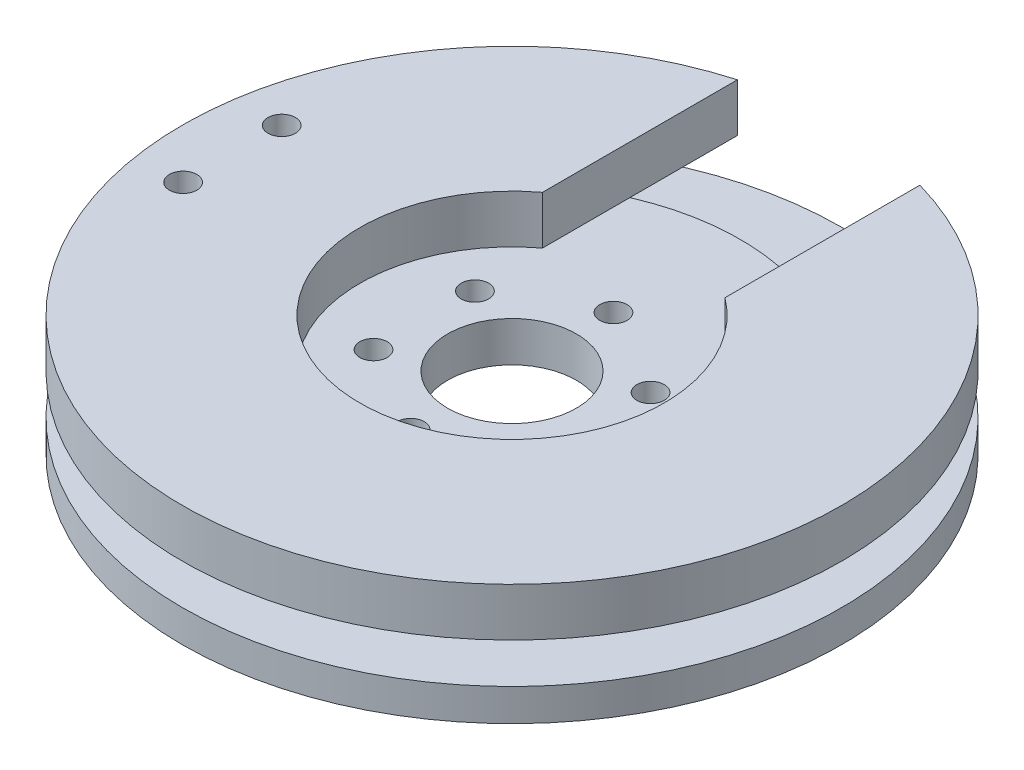
ISO-10303-21;
HEADER;
FILE_DESCRIPTION(('STEP AP214'),'2;1');
FILE_NAME('part.step','',(''),(''),'','','');
FILE_SCHEMA(('AUTOMOTIVE_DESIGN { 1 0 10303 214 1 1 1 1 }'));
ENDSEC;
DATA;
#1=APPLICATION_CONTEXT('core data for automotive mechanical design processes');
#2=APPLICATION_PROTOCOL_DEFINITION('international standard','automotive_design',2000,#1);
#3=PRODUCT_CONTEXT('',#1,'mechanical');
#4=PRODUCT('Part','Part','',(#3));
#5=PRODUCT_RELATED_PRODUCT_CATEGORY('part','',(#4));
#6=PRODUCT_DEFINITION_FORMATION('','',#4);
#7=PRODUCT_DEFINITION_CONTEXT('part definition',#1,'design');
#8=PRODUCT_DEFINITION('design','',#6,#7);
#9=PRODUCT_DEFINITION_SHAPE('','',#8);
#10=(LENGTH_UNIT() NAMED_UNIT(*) SI_UNIT(.MILLI.,.METRE.));
#11=(NAMED_UNIT(*) PLANE_ANGLE_UNIT() SI_UNIT($,.RADIAN.));
#12=(NAMED_UNIT(*) SI_UNIT($,.STERADIAN.) SOLID_ANGLE_UNIT());
#13=UNCERTAINTY_MEASURE_WITH_UNIT(LENGTH_MEASURE(1.E-05),#10,'distance_accuracy_value','');
#14=(GEOMETRIC_REPRESENTATION_CONTEXT(3) GLOBAL_UNCERTAINTY_ASSIGNED_CONTEXT((#13)) GLOBAL_UNIT_ASSIGNED_CONTEXT((#10,
#11,#12)) REPRESENTATION_CONTEXT('',''));
#15=CARTESIAN_POINT('',(0.,0.,0.));
#16=DIRECTION('',(0.,0.,1.));
#17=DIRECTION('',(1.,0.,0.));
#18=AXIS2_PLACEMENT_3D('',#15,#16,#17);
#19=CARTESIAN_POINT('',(0.,-8.7249,0.));
#20=DIRECTION('',(0.,1.,0.));
#21=DIRECTION('',(0.,0.,1.));
#22=AXIS2_PLACEMENT_3D('',#19,#20,#21);
#23=PLANE('',#22);
#24=CARTESIAN_POINT('',(-27.5746170843418,-8.7249,-4.86214897467412));
#25=DIRECTION('',(0.,1.,0.));
#26=DIRECTION('',(0.,0.,1.));
#27=AXIS2_PLACEMENT_3D('',#24,#25,#26);
#28=CIRCLE('',#27,3.57250999999999);
#29=CARTESIAN_POINT('',(-27.5746170843418,-8.7249,-1.28963897467412));
#30=VERTEX_POINT('',#29);
#31=EDGE_CURVE('E44',#30,#30,#28,.T.);
#32=ORIENTED_EDGE('',*,*,#31,.F.);
#33=EDGE_LOOP('',(#32));
#34=FACE_BOUND('',#33,.T.);
#35=CARTESIAN_POINT('',(-27.5746170843418,-8.7249,4.8621489746741));
#36=DIRECTION('',(0.,1.,0.));
#37=DIRECTION('',(0.,0.,1.));
#38=AXIS2_PLACEMENT_3D('',#35,#36,#37);
#39=CIRCLE('',#38,3.57250999999999);
#40=CARTESIAN_POINT('',(-27.5746170843418,-8.7249,8.4346589746741));
#41=VERTEX_POINT('',#40);
#42=EDGE_CURVE('E144',#41,#41,#39,.T.);
#43=ORIENTED_EDGE('',*,*,#42,.F.);
#44=EDGE_LOOP('',(#43));
#45=FACE_BOUND('',#44,.T.);
#46=CARTESIAN_POINT('',(0.,-8.7249,0.));
#47=DIRECTION('',(0.,1.,0.));
#48=DIRECTION('',(0.,0.,1.));
#49=AXIS2_PLACEMENT_3D('',#46,#47,#48);
#50=CIRCLE('',#49,22.5);
#51=CARTESIAN_POINT('',(0.,-8.7249,22.5));
#52=VERTEX_POINT('',#51);
#53=EDGE_CURVE('E107',#52,#52,#50,.F.);
#54=ORIENTED_EDGE('',*,*,#53,.T.);
#55=EDGE_LOOP('',(#54));
#56=FACE_BOUND('',#55,.T.);
#57=CARTESIAN_POINT('',(0.,-8.7249,0.));
#58=DIRECTION('',(0.,1.,0.));
#59=DIRECTION('',(0.,0.,1.));
#60=AXIS2_PLACEMENT_3D('',#57,#58,#59);
#61=CIRCLE('',#60,32.5);
#62=CARTESIAN_POINT('',(0.,-8.7249,32.5));
#63=VERTEX_POINT('',#62);
#64=EDGE_CURVE('E124',#63,#63,#61,.F.);
#65=ORIENTED_EDGE('',*,*,#64,.F.);
#66=EDGE_LOOP('',(#65));
#67=FACE_BOUND('',#66,.T.);
#68=ADVANCED_FACE('F36',(#34,#45,#56,#67),#23,.T.);
#69=CARTESIAN_POINT('',(0.,-4.7625,0.));
#70=DIRECTION('',(0.,1.,0.));
#71=DIRECTION('',(0.,0.,1.));
#72=AXIS2_PLACEMENT_3D('',#69,#70,#71);
#73=PLANE('',#72);
#74=CARTESIAN_POINT('',(0.,-4.7625,10.));
#75=DIRECTION('',(0.,1.,0.));
#76=DIRECTION('',(0.,0.,1.));
#77=AXIS2_PLACEMENT_3D('',#74,#75,#76);
#78=CIRCLE('',#77,1.35254999999999);
#79=CARTESIAN_POINT('',(0.,-4.7625,11.35255));
#80=VERTEX_POINT('',#79);
#81=EDGE_CURVE('E160',#80,#80,#78,.T.);
#82=ORIENTED_EDGE('',*,*,#81,.F.);
#83=EDGE_LOOP('',(#82));
#84=FACE_BOUND('',#83,.T.);
#85=CARTESIAN_POINT('',(-8.66025403784436,-4.7625,-5.00000000000004));
#86=DIRECTION('',(0.,1.,0.));
#87=DIRECTION('',(0.,0.,1.));
#88=AXIS2_PLACEMENT_3D('',#85,#86,#87);
#89=CIRCLE('',#88,1.35254999999999);
#90=CARTESIAN_POINT('',(-8.66025403784436,-4.7625,-3.64745000000005));
#91=VERTEX_POINT('',#90);
#92=EDGE_CURVE('E166',#91,#91,#89,.T.);
#93=ORIENTED_EDGE('',*,*,#92,.F.);
#94=EDGE_LOOP('',(#93));
#95=FACE_BOUND('',#94,.T.);
#96=CARTESIAN_POINT('',(8.66025403784436,-4.7625,-5.00000000000004));
#97=DIRECTION('',(0.,1.,0.));
#98=DIRECTION('',(0.,0.,1.));
#99=AXIS2_PLACEMENT_3D('',#96,#97,#98);
#100=CIRCLE('',#99,1.35254999999999);
#101=CARTESIAN_POINT('',(8.66025403784436,-4.7625,-3.64745000000005));
#102=VERTEX_POINT('',#101);
#103=EDGE_CURVE('E172',#102,#102,#100,.T.);
#104=ORIENTED_EDGE('',*,*,#103,.F.);
#105=EDGE_LOOP('',(#104));
#106=FACE_BOUND('',#105,.T.);
#107=CARTESIAN_POINT('',(-8.66025403784436,-4.7625,5.00000000000004));
#108=DIRECTION('',(0.,1.,0.));
#109=DIRECTION('',(0.,0.,1.));
#110=AXIS2_PLACEMENT_3D('',#107,#108,#109);
#111=CIRCLE('',#110,1.35254999999999);
#112=CARTESIAN_POINT('',(-8.66025403784436,-4.7625,6.35255000000003));
#113=VERTEX_POINT('',#112);
#114=EDGE_CURVE('E178',#113,#113,#111,.T.);
#115=ORIENTED_EDGE('',*,*,#114,.F.);
#116=EDGE_LOOP('',(#115));
#117=FACE_BOUND('',#116,.T.);
#118=CARTESIAN_POINT('',(0.,-4.7625,-10.));
#119=DIRECTION('',(0.,1.,0.));
#120=DIRECTION('',(0.,0.,1.));
#121=AXIS2_PLACEMENT_3D('',#118,#119,#120);
#122=CIRCLE('',#121,1.35254999999999);
#123=CARTESIAN_POINT('',(0.,-4.7625,-8.64745000000001));
#124=VERTEX_POINT('',#123);
#125=EDGE_CURVE('E184',#124,#124,#122,.T.);
#126=ORIENTED_EDGE('',*,*,#125,.F.);
#127=EDGE_LOOP('',(#126));
#128=FACE_BOUND('',#127,.T.);
#129=CARTESIAN_POINT('',(8.66025403784436,-4.7625,5.00000000000004));
#130=DIRECTION('',(0.,1.,0.));
#131=DIRECTION('',(0.,0.,1.));
#132=AXIS2_PLACEMENT_3D('',#129,#130,#131);
#133=CIRCLE('',#132,1.35254999999999);
#134=CARTESIAN_POINT('',(8.66025403784436,-4.7625,6.35255000000004));
#135=VERTEX_POINT('',#134);
#136=EDGE_CURVE('E139',#135,#135,#133,.T.);
#137=ORIENTED_EDGE('',*,*,#136,.F.);
#138=EDGE_LOOP('',(#137));
#139=FACE_BOUND('',#138,.T.);
#140=CARTESIAN_POINT('',(0.,-4.7625,0.));
#141=DIRECTION('',(0.,1.,0.));
#142=DIRECTION('',(0.,0.,1.));
#143=AXIS2_PLACEMENT_3D('',#140,#141,#142);
#144=CIRCLE('',#143,6.35);
#145=CARTESIAN_POINT('',(0.,-4.7625,6.35));
#146=VERTEX_POINT('',#145);
#147=EDGE_CURVE('E102',#146,#146,#144,.F.);
#148=ORIENTED_EDGE('',*,*,#147,.T.);
#149=EDGE_LOOP('',(#148));
#150=FACE_BOUND('',#149,.T.);
#151=CARTESIAN_POINT('',(0.,-4.7625,0.));
#152=DIRECTION('',(0.,1.,0.));
#153=DIRECTION('',(0.,0.,1.));
#154=AXIS2_PLACEMENT_3D('',#151,#152,#153);
#155=CIRCLE('',#154,15.);
#156=CARTESIAN_POINT('',(8.99999999999999,-4.7625,-12.));
#157=VERTEX_POINT('',#156);
#158=CARTESIAN_POINT('',(-9.00000000000001,-4.7625,-12.));
#159=VERTEX_POINT('',#158);
#160=EDGE_CURVE('E76',#157,#159,#155,.F.);
#161=ORIENTED_EDGE('',*,*,#160,.F.);
#162=DIRECTION('',(0.,0.,-1.));
#163=VECTOR('',#162,1.);
#164=CARTESIAN_POINT('',(8.99999999999998,-4.7625,0.));
#165=LINE('',#164,#163);
#166=CARTESIAN_POINT('',(8.99999999999999,-4.7625,-20.6215906273013));
#167=VERTEX_POINT('',#166);
#168=EDGE_CURVE('E71',#157,#167,#165,.T.);
#169=ORIENTED_EDGE('',*,*,#168,.T.);
#170=CARTESIAN_POINT('',(0.,-4.7625,0.));
#171=DIRECTION('',(0.,1.,0.));
#172=DIRECTION('',(0.,0.,1.));
#173=AXIS2_PLACEMENT_3D('',#170,#171,#172);
#174=CIRCLE('',#173,22.5);
#175=CARTESIAN_POINT('',(-9.00000000000001,-4.7625,-20.6215906273013));
#176=VERTEX_POINT('',#175);
#177=EDGE_CURVE('E101',#176,#167,#174,.F.);
#178=ORIENTED_EDGE('',*,*,#177,.F.);
#179=DIRECTION('',(0.,0.,-1.));
#180=VECTOR('',#179,1.);
#181=CARTESIAN_POINT('',(-9.00000000000001,-4.7625,0.));
#182=LINE('',#181,#180);
#183=EDGE_CURVE('E80',#159,#176,#182,.T.);
#184=ORIENTED_EDGE('',*,*,#183,.F.);
#185=EDGE_LOOP('',(#161,#169,#178,#184));
#186=FACE_BOUND('',#185,.T.);
#187=ADVANCED_FACE('F78',(#84,#95,#106,#117,#128,#139,#150,#186),#73,.T.);
#188=CARTESIAN_POINT('',(0.,-8.7249,0.));
#189=DIRECTION('',(0.,1.,0.));
#190=DIRECTION('',(0.,0.,1.));
#191=AXIS2_PLACEMENT_3D('',#188,#189,#190);
#192=CYLINDRICAL_SURFACE('',#191,22.5);
#193=ORIENTED_EDGE('',*,*,#53,.F.);
#194=EDGE_LOOP('',(#193));
#195=FACE_BOUND('',#194,.T.);
#196=ORIENTED_EDGE('',*,*,#177,.T.);
#197=EDGE_CURVE('E104',#167,#176,#174,.F.);
#198=ORIENTED_EDGE('',*,*,#197,.T.);
#199=EDGE_LOOP('',(#196,#198));
#200=FACE_BOUND('',#199,.T.);
#201=ADVANCED_FACE('F204',(#195,#200),#192,.T.);
#202=CARTESIAN_POINT('',(0.,-8.7249,0.));
#203=DIRECTION('',(0.,1.,0.));
#204=DIRECTION('',(0.,0.,1.));
#205=AXIS2_PLACEMENT_3D('',#202,#203,#204);
#206=CYLINDRICAL_SURFACE('',#205,6.35);
#207=CARTESIAN_POINT('',(0.,-8.7249,0.));
#208=DIRECTION('',(0.,1.,0.));
#209=DIRECTION('',(0.,0.,1.));
#210=AXIS2_PLACEMENT_3D('',#207,#208,#209);
#211=CIRCLE('',#210,6.35);
#212=CARTESIAN_POINT('',(0.,-8.7249,6.35));
#213=VERTEX_POINT('',#212);
#214=EDGE_CURVE('E131',#213,#213,#211,.F.);
#215=ORIENTED_EDGE('',*,*,#214,.T.);
#216=EDGE_LOOP('',(#215));
#217=FACE_BOUND('',#216,.T.);
#218=ORIENTED_EDGE('',*,*,#147,.F.);
#219=EDGE_LOOP('',(#218));
#220=FACE_BOUND('',#219,.T.);
#221=ADVANCED_FACE('F195',(#217,#220),#206,.F.);
#222=CARTESIAN_POINT('',(0.,-8.7249,0.));
#223=DIRECTION('',(0.,1.,0.));
#224=DIRECTION('',(0.,0.,1.));
#225=AXIS2_PLACEMENT_3D('',#222,#223,#224);
#226=PLANE('',#225);
#227=CARTESIAN_POINT('',(0.,-8.7249,10.));
#228=DIRECTION('',(0.,-1.,0.));
#229=DIRECTION('',(0.,0.,-1.));
#230=AXIS2_PLACEMENT_3D('',#227,#228,#229);
#231=CIRCLE('',#230,1.35254999999999);
#232=CARTESIAN_POINT('',(0.,-8.7249,8.64745000000001));
#233=VERTEX_POINT('',#232);
#234=EDGE_CURVE('E147',#233,#233,#231,.T.);
#235=ORIENTED_EDGE('',*,*,#234,.F.);
#236=EDGE_LOOP('',(#235));
#237=FACE_BOUND('',#236,.T.);
#238=CARTESIAN_POINT('',(-8.66025403784436,-8.7249,-5.00000000000004));
#239=DIRECTION('',(0.,-1.,0.));
#240=DIRECTION('',(0.,0.,-1.));
#241=AXIS2_PLACEMENT_3D('',#238,#239,#240);
#242=CIRCLE('',#241,1.35254999999999);
#243=CARTESIAN_POINT('',(-8.66025403784436,-8.7249,-6.35255000000003));
#244=VERTEX_POINT('',#243);
#245=EDGE_CURVE('E163',#244,#244,#242,.T.);
#246=ORIENTED_EDGE('',*,*,#245,.F.);
#247=EDGE_LOOP('',(#246));
#248=FACE_BOUND('',#247,.T.);
#249=CARTESIAN_POINT('',(8.66025403784436,-8.7249,-5.00000000000004));
#250=DIRECTION('',(0.,-1.,0.));
#251=DIRECTION('',(0.,0.,-1.));
#252=AXIS2_PLACEMENT_3D('',#249,#250,#251);
#253=CIRCLE('',#252,1.35254999999999);
#254=CARTESIAN_POINT('',(8.66025403784436,-8.7249,-6.35255000000003));
#255=VERTEX_POINT('',#254);
#256=EDGE_CURVE('E169',#255,#255,#253,.T.);
#257=ORIENTED_EDGE('',*,*,#256,.F.);
#258=EDGE_LOOP('',(#257));
#259=FACE_BOUND('',#258,.T.);
#260=CARTESIAN_POINT('',(-8.66025403784436,-8.7249,5.00000000000004));
#261=DIRECTION('',(0.,-1.,0.));
#262=DIRECTION('',(0.,0.,-1.));
#263=AXIS2_PLACEMENT_3D('',#260,#261,#262);
#264=CIRCLE('',#263,1.35254999999999);
#265=CARTESIAN_POINT('',(-8.66025403784436,-8.7249,3.64745000000006));
#266=VERTEX_POINT('',#265);
#267=EDGE_CURVE('E175',#266,#266,#264,.T.);
#268=ORIENTED_EDGE('',*,*,#267,.F.);
#269=EDGE_LOOP('',(#268));
#270=FACE_BOUND('',#269,.T.);
#271=CARTESIAN_POINT('',(0.,-8.7249,-10.));
#272=DIRECTION('',(0.,-1.,0.));
#273=DIRECTION('',(0.,0.,-1.));
#274=AXIS2_PLACEMENT_3D('',#271,#272,#273);
#275=CIRCLE('',#274,1.35254999999999);
#276=CARTESIAN_POINT('',(0.,-8.7249,-11.35255));
#277=VERTEX_POINT('',#276);
#278=EDGE_CURVE('E181',#277,#277,#275,.T.);
#279=ORIENTED_EDGE('',*,*,#278,.F.);
#280=EDGE_LOOP('',(#279));
#281=FACE_BOUND('',#280,.T.);
#282=CARTESIAN_POINT('',(8.66025403784436,-8.7249,5.00000000000004));
#283=DIRECTION('',(0.,-1.,0.));
#284=DIRECTION('',(0.,0.,-1.));
#285=AXIS2_PLACEMENT_3D('',#282,#283,#284);
#286=CIRCLE('',#285,1.35254999999999);
#287=CARTESIAN_POINT('',(8.66025403784436,-8.7249,3.64745000000006));
#288=VERTEX_POINT('',#287);
#289=EDGE_CURVE('E142',#288,#288,#286,.T.);
#290=ORIENTED_EDGE('',*,*,#289,.F.);
#291=EDGE_LOOP('',(#290));
#292=FACE_BOUND('',#291,.T.);
#293=CARTESIAN_POINT('',(0.,-8.7249,0.));
#294=DIRECTION('',(0.,1.,0.));
#295=DIRECTION('',(0.,0.,1.));
#296=AXIS2_PLACEMENT_3D('',#293,#294,#295);
#297=CIRCLE('',#296,15.);
#298=CARTESIAN_POINT('',(0.,-8.7249,15.));
#299=VERTEX_POINT('',#298);
#300=EDGE_CURVE('E125',#299,#299,#297,.F.);
#301=ORIENTED_EDGE('',*,*,#300,.T.);
#302=EDGE_LOOP('',(#301));
#303=FACE_BOUND('',#302,.T.);
#304=ORIENTED_EDGE('',*,*,#214,.F.);
#305=EDGE_LOOP('',(#304));
#306=FACE_BOUND('',#305,.T.);
#307=ADVANCED_FACE('F191',(#237,#248,#259,#270,#281,#292,#303,#306),#226,.F.);
#308=CARTESIAN_POINT('',(0.,-11.8999,0.));
#309=DIRECTION('',(0.,1.,0.));
#310=DIRECTION('',(0.,0.,1.));
#311=AXIS2_PLACEMENT_3D('',#308,#309,#310);
#312=CYLINDRICAL_SURFACE('',#311,15.);
#313=CARTESIAN_POINT('',(0.,-11.8999,0.));
#314=DIRECTION('',(0.,1.,0.));
#315=DIRECTION('',(0.,0.,1.));
#316=AXIS2_PLACEMENT_3D('',#313,#314,#315);
#317=CIRCLE('',#316,15.);
#318=CARTESIAN_POINT('',(0.,-11.8999,15.));
#319=VERTEX_POINT('',#318);
#320=EDGE_CURVE('E121',#319,#319,#317,.F.);
#321=ORIENTED_EDGE('',*,*,#320,.T.);
#322=EDGE_LOOP('',(#321));
#323=FACE_BOUND('',#322,.T.);
#324=ORIENTED_EDGE('',*,*,#300,.F.);
#325=EDGE_LOOP('',(#324));
#326=FACE_BOUND('',#325,.T.);
#327=ADVANCED_FACE('F194',(#323,#326),#312,.F.);
#328=CARTESIAN_POINT('',(0.,-11.8999,0.));
#329=DIRECTION('',(0.,1.,0.));
#330=DIRECTION('',(0.,0.,1.));
#331=AXIS2_PLACEMENT_3D('',#328,#329,#330);
#332=CYLINDRICAL_SURFACE('',#331,32.5);
#333=CARTESIAN_POINT('',(0.,-11.8999,0.));
#334=DIRECTION('',(0.,1.,0.));
#335=DIRECTION('',(0.,0.,1.));
#336=AXIS2_PLACEMENT_3D('',#333,#334,#335);
#337=CIRCLE('',#336,32.5);
#338=CARTESIAN_POINT('',(0.,-11.8999,32.5));
#339=VERTEX_POINT('',#338);
#340=EDGE_CURVE('E126',#339,#339,#337,.F.);
#341=ORIENTED_EDGE('',*,*,#340,.F.);
#342=EDGE_LOOP('',(#341));
#343=FACE_BOUND('',#342,.T.);
#344=ORIENTED_EDGE('',*,*,#64,.T.);
#345=EDGE_LOOP('',(#344));
#346=FACE_BOUND('',#345,.T.);
#347=ADVANCED_FACE('F241',(#343,#346),#332,.T.);
#348=CARTESIAN_POINT('',(0.,-11.8999,0.));
#349=DIRECTION('',(0.,1.,0.));
#350=DIRECTION('',(0.,0.,1.));
#351=AXIS2_PLACEMENT_3D('',#348,#349,#350);
#352=PLANE('',#351);
#353=CARTESIAN_POINT('',(-27.5746170843418,-11.8999,-4.86214897467412));
#354=DIRECTION('',(0.,-1.,0.));
#355=DIRECTION('',(0.,0.,-1.));
#356=AXIS2_PLACEMENT_3D('',#353,#354,#355);
#357=CIRCLE('',#356,3.57250999999999);
#358=CARTESIAN_POINT('',(-27.5746170843418,-11.8999,-8.43465897467411));
#359=VERTEX_POINT('',#358);
#360=EDGE_CURVE('E11',#359,#359,#357,.T.);
#361=ORIENTED_EDGE('',*,*,#360,.F.);
#362=EDGE_LOOP('',(#361));
#363=FACE_BOUND('',#362,.T.);
#364=CARTESIAN_POINT('',(-27.5746170843418,-11.8999,4.8621489746741));
#365=DIRECTION('',(0.,-1.,0.));
#366=DIRECTION('',(0.,0.,-1.));
#367=AXIS2_PLACEMENT_3D('',#364,#365,#366);
#368=CIRCLE('',#367,3.57250999999999);
#369=CARTESIAN_POINT('',(-27.5746170843418,-11.8999,1.28963897467411));
#370=VERTEX_POINT('',#369);
#371=EDGE_CURVE('E146',#370,#370,#368,.T.);
#372=ORIENTED_EDGE('',*,*,#371,.F.);
#373=EDGE_LOOP('',(#372));
#374=FACE_BOUND('',#373,.T.);
#375=ORIENTED_EDGE('',*,*,#320,.F.);
#376=EDGE_LOOP('',(#375));
#377=FACE_BOUND('',#376,.T.);
#378=ORIENTED_EDGE('',*,*,#340,.T.);
#379=EDGE_LOOP('',(#378));
#380=FACE_BOUND('',#379,.T.);
#381=ADVANCED_FACE('F238',(#363,#374,#377,#380),#352,.F.);
#382=CARTESIAN_POINT('',(8.99999999999998,-4.7625,0.));
#383=DIRECTION('',(1.,0.,0.));
#384=DIRECTION('',(0.,0.,-1.));
#385=AXIS2_PLACEMENT_3D('',#382,#383,#384);
#386=PLANE('',#385);
#387=DIRECTION('',(0.,0.,-1.));
#388=VECTOR('',#387,1.);
#389=CARTESIAN_POINT('',(8.99999999999998,0.,0.));
#390=LINE('',#389,#388);
#391=CARTESIAN_POINT('',(8.99999999999999,0.,-12.));
#392=VERTEX_POINT('',#391);
#393=CARTESIAN_POINT('',(9.,0.,-31.2289929392544));
#394=VERTEX_POINT('',#393);
#395=EDGE_CURVE('E95',#392,#394,#390,.T.);
#396=ORIENTED_EDGE('',*,*,#395,.T.);
#397=DIRECTION('',(0.,1.,0.));
#398=VECTOR('',#397,1.);
#399=CARTESIAN_POINT('',(9.,-4.7625,-31.2289929392544));
#400=LINE('',#399,#398);
#401=CARTESIAN_POINT('',(9.,-4.7625,-31.2289929392544));
#402=VERTEX_POINT('',#401);
#403=EDGE_CURVE('E328',#402,#394,#400,.T.);
#404=ORIENTED_EDGE('',*,*,#403,.F.);
#405=EDGE_CURVE('E100',#167,#402,#165,.T.);
#406=ORIENTED_EDGE('',*,*,#405,.F.);
#407=ORIENTED_EDGE('',*,*,#168,.F.);
#408=DIRECTION('',(0.,1.,0.));
#409=VECTOR('',#408,1.);
#410=CARTESIAN_POINT('',(8.99999999999999,-4.7625,-12.));
#411=LINE('',#410,#409);
#412=EDGE_CURVE('E89',#157,#392,#411,.T.);
#413=ORIENTED_EDGE('',*,*,#412,.T.);
#414=EDGE_LOOP('',(#396,#404,#406,#407,#413));
#415=FACE_BOUND('',#414,.T.);
#416=ADVANCED_FACE('F98',(#415),#386,.F.);
#417=CARTESIAN_POINT('',(0.,-4.7625,0.));
#418=DIRECTION('',(0.,1.,0.));
#419=DIRECTION('',(0.,0.,1.));
#420=AXIS2_PLACEMENT_3D('',#417,#418,#419);
#421=CYLINDRICAL_SURFACE('',#420,32.5);
#422=CARTESIAN_POINT('',(0.,0.,0.));
#423=DIRECTION('',(0.,1.,0.));
#424=DIRECTION('',(0.,0.,1.));
#425=AXIS2_PLACEMENT_3D('',#422,#423,#424);
#426=CIRCLE('',#425,32.5);
#427=CARTESIAN_POINT('',(-9.,0.,-31.2289929392544));
#428=VERTEX_POINT('',#427);
#429=EDGE_CURVE('E52',#394,#428,#426,.F.);
#430=ORIENTED_EDGE('',*,*,#429,.T.);
#431=DIRECTION('',(0.,1.,0.));
#432=VECTOR('',#431,1.);
#433=CARTESIAN_POINT('',(-9.,-4.7625,-31.2289929392544));
#434=LINE('',#433,#432);
#435=CARTESIAN_POINT('',(-9.,-4.7625,-31.2289929392544));
#436=VERTEX_POINT('',#435);
#437=EDGE_CURVE('E85',#436,#428,#434,.T.);
#438=ORIENTED_EDGE('',*,*,#437,.F.);
#439=CARTESIAN_POINT('',(0.,-4.7625,0.));
#440=DIRECTION('',(0.,1.,0.));
#441=DIRECTION('',(0.,0.,1.));
#442=AXIS2_PLACEMENT_3D('',#439,#440,#441);
#443=CIRCLE('',#442,32.5);
#444=EDGE_CURVE('E110',#402,#436,#443,.F.);
#445=ORIENTED_EDGE('',*,*,#444,.F.);
#446=ORIENTED_EDGE('',*,*,#403,.T.);
#447=EDGE_LOOP('',(#430,#438,#445,#446));
#448=FACE_BOUND('',#447,.T.);
#449=ADVANCED_FACE('F260',(#448),#421,.T.);
#450=CARTESIAN_POINT('',(-9.00000000000001,-4.7625,0.));
#451=DIRECTION('',(1.,0.,0.));
#452=DIRECTION('',(0.,0.,-1.));
#453=AXIS2_PLACEMENT_3D('',#450,#451,#452);
#454=PLANE('',#453);
#455=DIRECTION('',(0.,0.,-1.));
#456=VECTOR('',#455,1.);
#457=CARTESIAN_POINT('',(-9.00000000000001,0.,0.));
#458=LINE('',#457,#456);
#459=CARTESIAN_POINT('',(-9.00000000000001,0.,-12.));
#460=VERTEX_POINT('',#459);
#461=EDGE_CURVE('E143',#460,#428,#458,.T.);
#462=ORIENTED_EDGE('',*,*,#461,.F.);
#463=DIRECTION('',(0.,1.,0.));
#464=VECTOR('',#463,1.);
#465=CARTESIAN_POINT('',(-9.00000000000001,-4.7625,-12.));
#466=LINE('',#465,#464);
#467=EDGE_CURVE('E84',#159,#460,#466,.T.);
#468=ORIENTED_EDGE('',*,*,#467,.F.);
#469=ORIENTED_EDGE('',*,*,#183,.T.);
#470=EDGE_CURVE('E322',#176,#436,#182,.T.);
#471=ORIENTED_EDGE('',*,*,#470,.T.);
#472=ORIENTED_EDGE('',*,*,#437,.T.);
#473=EDGE_LOOP('',(#462,#468,#469,#471,#472));
#474=FACE_BOUND('',#473,.T.);
#475=ADVANCED_FACE('F264',(#474),#454,.T.);
#476=CARTESIAN_POINT('',(0.,-4.7625,0.));
#477=DIRECTION('',(0.,1.,0.));
#478=DIRECTION('',(0.,0.,1.));
#479=AXIS2_PLACEMENT_3D('',#476,#477,#478);
#480=CYLINDRICAL_SURFACE('',#479,15.);
#481=CARTESIAN_POINT('',(0.,0.,0.));
#482=DIRECTION('',(0.,1.,0.));
#483=DIRECTION('',(0.,0.,1.));
#484=AXIS2_PLACEMENT_3D('',#481,#482,#483);
#485=CIRCLE('',#484,15.);
#486=EDGE_CURVE('E92',#392,#460,#485,.F.);
#487=ORIENTED_EDGE('',*,*,#486,.F.);
#488=ORIENTED_EDGE('',*,*,#412,.F.);
#489=ORIENTED_EDGE('',*,*,#160,.T.);
#490=ORIENTED_EDGE('',*,*,#467,.T.);
#491=EDGE_LOOP('',(#487,#488,#489,#490));
#492=FACE_BOUND('',#491,.T.);
#493=ADVANCED_FACE('F90',(#492),#480,.F.);
#494=CARTESIAN_POINT('',(0.,-4.7625,0.));
#495=DIRECTION('',(0.,1.,0.));
#496=DIRECTION('',(0.,0.,1.));
#497=AXIS2_PLACEMENT_3D('',#494,#495,#496);
#498=PLANE('',#497);
#499=CARTESIAN_POINT('',(-27.5746170843418,-4.7625,4.86214897467406));
#500=DIRECTION('',(0.,1.,0.));
#501=DIRECTION('',(0.,0.,1.));
#502=AXIS2_PLACEMENT_3D('',#499,#500,#501);
#503=CIRCLE('',#502,1.35254999999999);
#504=CARTESIAN_POINT('',(-27.5746170843418,-4.7625,6.21469897467405));
#505=VERTEX_POINT('',#504);
#506=EDGE_CURVE('E310',#505,#505,#503,.T.);
#507=ORIENTED_EDGE('',*,*,#506,.T.);
#508=EDGE_LOOP('',(#507));
#509=FACE_BOUND('',#508,.T.);
#510=CARTESIAN_POINT('',(-27.5746170843418,-4.7625,-4.86214897467406));
#511=DIRECTION('',(0.,1.,0.));
#512=DIRECTION('',(0.,0.,1.));
#513=AXIS2_PLACEMENT_3D('',#510,#511,#512);
#514=CIRCLE('',#513,1.35254999999999);
#515=CARTESIAN_POINT('',(-27.5746170843418,-4.7625,-3.50959897467406));
#516=VERTEX_POINT('',#515);
#517=EDGE_CURVE('E136',#516,#516,#514,.T.);
#518=ORIENTED_EDGE('',*,*,#517,.T.);
#519=EDGE_LOOP('',(#518));
#520=FACE_BOUND('',#519,.T.);
#521=ORIENTED_EDGE('',*,*,#197,.F.);
#522=ORIENTED_EDGE('',*,*,#405,.T.);
#523=ORIENTED_EDGE('',*,*,#444,.T.);
#524=ORIENTED_EDGE('',*,*,#470,.F.);
#525=EDGE_LOOP('',(#521,#522,#523,#524));
#526=FACE_BOUND('',#525,.T.);
#527=ADVANCED_FACE('F263',(#509,#520,#526),#498,.F.);
#528=CARTESIAN_POINT('',(0.,0.,0.));
#529=DIRECTION('',(0.,1.,0.));
#530=DIRECTION('',(0.,0.,1.));
#531=AXIS2_PLACEMENT_3D('',#528,#529,#530);
#532=PLANE('',#531);
#533=CARTESIAN_POINT('',(-27.5746170843418,0.,4.86214897467406));
#534=DIRECTION('',(0.,1.,0.));
#535=DIRECTION('',(0.,0.,1.));
#536=AXIS2_PLACEMENT_3D('',#533,#534,#535);
#537=CIRCLE('',#536,1.35254999999999);
#538=CARTESIAN_POINT('',(-27.5746170843418,0.,6.21469897467405));
#539=VERTEX_POINT('',#538);
#540=EDGE_CURVE('E307',#539,#539,#537,.T.);
#541=ORIENTED_EDGE('',*,*,#540,.F.);
#542=EDGE_LOOP('',(#541));
#543=FACE_BOUND('',#542,.T.);
#544=CARTESIAN_POINT('',(-27.5746170843418,0.,-4.86214897467406));
#545=DIRECTION('',(0.,1.,0.));
#546=DIRECTION('',(0.,0.,1.));
#547=AXIS2_PLACEMENT_3D('',#544,#545,#546);
#548=CIRCLE('',#547,1.35254999999999);
#549=CARTESIAN_POINT('',(-27.5746170843418,0.,-3.50959897467407));
#550=VERTEX_POINT('',#549);
#551=EDGE_CURVE('E311',#550,#550,#548,.T.);
#552=ORIENTED_EDGE('',*,*,#551,.F.);
#553=EDGE_LOOP('',(#552));
#554=FACE_BOUND('',#553,.T.);
#555=ORIENTED_EDGE('',*,*,#395,.F.);
#556=ORIENTED_EDGE('',*,*,#486,.T.);
#557=ORIENTED_EDGE('',*,*,#461,.T.);
#558=ORIENTED_EDGE('',*,*,#429,.F.);
#559=EDGE_LOOP('',(#555,#556,#557,#558));
#560=FACE_BOUND('',#559,.T.);
#561=ADVANCED_FACE('F271',(#543,#554,#560),#532,.T.);
#562=CARTESIAN_POINT('',(8.66025403784436,-8.7249,5.00000000000004));
#563=DIRECTION('',(0.,-1.,0.));
#564=DIRECTION('',(0.,0.,-1.));
#565=AXIS2_PLACEMENT_3D('',#562,#563,#564);
#566=CYLINDRICAL_SURFACE('',#565,1.35254999999999);
#567=ORIENTED_EDGE('',*,*,#136,.T.);
#568=EDGE_LOOP('',(#567));
#569=FACE_BOUND('',#568,.T.);
#570=ORIENTED_EDGE('',*,*,#289,.T.);
#571=EDGE_LOOP('',(#570));
#572=FACE_BOUND('',#571,.T.);
#573=ADVANCED_FACE('F189',(#569,#572),#566,.F.);
#574=CARTESIAN_POINT('',(0.,-8.7249,-10.));
#575=DIRECTION('',(0.,-1.,0.));
#576=DIRECTION('',(0.,0.,-1.));
#577=AXIS2_PLACEMENT_3D('',#574,#575,#576);
#578=CYLINDRICAL_SURFACE('',#577,1.35254999999999);
#579=ORIENTED_EDGE('',*,*,#125,.T.);
#580=EDGE_LOOP('',(#579));
#581=FACE_BOUND('',#580,.T.);
#582=ORIENTED_EDGE('',*,*,#278,.T.);
#583=EDGE_LOOP('',(#582));
#584=FACE_BOUND('',#583,.T.);
#585=ADVANCED_FACE('F280',(#581,#584),#578,.F.);
#586=CARTESIAN_POINT('',(-8.66025403784436,-8.7249,5.00000000000004));
#587=DIRECTION('',(0.,-1.,0.));
#588=DIRECTION('',(0.,0.,-1.));
#589=AXIS2_PLACEMENT_3D('',#586,#587,#588);
#590=CYLINDRICAL_SURFACE('',#589,1.35254999999999);
#591=ORIENTED_EDGE('',*,*,#114,.T.);
#592=EDGE_LOOP('',(#591));
#593=FACE_BOUND('',#592,.T.);
#594=ORIENTED_EDGE('',*,*,#267,.T.);
#595=EDGE_LOOP('',(#594));
#596=FACE_BOUND('',#595,.T.);
#597=ADVANCED_FACE('F284',(#593,#596),#590,.F.);
#598=CARTESIAN_POINT('',(8.66025403784436,-8.7249,-5.00000000000004));
#599=DIRECTION('',(0.,-1.,0.));
#600=DIRECTION('',(0.,0.,-1.));
#601=AXIS2_PLACEMENT_3D('',#598,#599,#600);
#602=CYLINDRICAL_SURFACE('',#601,1.35254999999999);
#603=ORIENTED_EDGE('',*,*,#103,.T.);
#604=EDGE_LOOP('',(#603));
#605=FACE_BOUND('',#604,.T.);
#606=ORIENTED_EDGE('',*,*,#256,.T.);
#607=EDGE_LOOP('',(#606));
#608=FACE_BOUND('',#607,.T.);
#609=ADVANCED_FACE('F288',(#605,#608),#602,.F.);
#610=CARTESIAN_POINT('',(-8.66025403784436,-8.7249,-5.00000000000004));
#611=DIRECTION('',(0.,-1.,0.));
#612=DIRECTION('',(0.,0.,-1.));
#613=AXIS2_PLACEMENT_3D('',#610,#611,#612);
#614=CYLINDRICAL_SURFACE('',#613,1.35254999999999);
#615=ORIENTED_EDGE('',*,*,#92,.T.);
#616=EDGE_LOOP('',(#615));
#617=FACE_BOUND('',#616,.T.);
#618=ORIENTED_EDGE('',*,*,#245,.T.);
#619=EDGE_LOOP('',(#618));
#620=FACE_BOUND('',#619,.T.);
#621=ADVANCED_FACE('F292',(#617,#620),#614,.F.);
#622=CARTESIAN_POINT('',(0.,-8.7249,10.));
#623=DIRECTION('',(0.,-1.,0.));
#624=DIRECTION('',(0.,0.,-1.));
#625=AXIS2_PLACEMENT_3D('',#622,#623,#624);
#626=CYLINDRICAL_SURFACE('',#625,1.35254999999999);
#627=ORIENTED_EDGE('',*,*,#81,.T.);
#628=EDGE_LOOP('',(#627));
#629=FACE_BOUND('',#628,.T.);
#630=ORIENTED_EDGE('',*,*,#234,.T.);
#631=EDGE_LOOP('',(#630));
#632=FACE_BOUND('',#631,.T.);
#633=ADVANCED_FACE('F232',(#629,#632),#626,.F.);
#634=CARTESIAN_POINT('',(-27.5746170843418,-11.8999,4.8621489746741));
#635=DIRECTION('',(0.,-1.,0.));
#636=DIRECTION('',(0.,0.,-1.));
#637=AXIS2_PLACEMENT_3D('',#634,#635,#636);
#638=CYLINDRICAL_SURFACE('',#637,3.57250999999999);
#639=ORIENTED_EDGE('',*,*,#42,.T.);
#640=EDGE_LOOP('',(#639));
#641=FACE_BOUND('',#640,.T.);
#642=ORIENTED_EDGE('',*,*,#371,.T.);
#643=EDGE_LOOP('',(#642));
#644=FACE_BOUND('',#643,.T.);
#645=ADVANCED_FACE('F224',(#641,#644),#638,.F.);
#646=CARTESIAN_POINT('',(-27.5746170843418,-11.8999,-4.86214897467412));
#647=DIRECTION('',(0.,-1.,0.));
#648=DIRECTION('',(0.,0.,-1.));
#649=AXIS2_PLACEMENT_3D('',#646,#647,#648);
#650=CYLINDRICAL_SURFACE('',#649,3.57250999999999);
#651=ORIENTED_EDGE('',*,*,#31,.T.);
#652=EDGE_LOOP('',(#651));
#653=FACE_BOUND('',#652,.T.);
#654=ORIENTED_EDGE('',*,*,#360,.T.);
#655=EDGE_LOOP('',(#654));
#656=FACE_BOUND('',#655,.T.);
#657=ADVANCED_FACE('F221',(#653,#656),#650,.F.);
#658=CARTESIAN_POINT('',(-27.5746170843418,0.,-4.86214897467406));
#659=DIRECTION('',(0.,1.,0.));
#660=DIRECTION('',(0.,0.,1.));
#661=AXIS2_PLACEMENT_3D('',#658,#659,#660);
#662=CYLINDRICAL_SURFACE('',#661,1.35254999999999);
#663=ORIENTED_EDGE('',*,*,#551,.T.);
#664=EDGE_LOOP('',(#663));
#665=FACE_BOUND('',#664,.T.);
#666=ORIENTED_EDGE('',*,*,#517,.F.);
#667=EDGE_LOOP('',(#666));
#668=FACE_BOUND('',#667,.T.);
#669=ADVANCED_FACE('F223',(#665,#668),#662,.F.);
#670=CARTESIAN_POINT('',(-27.5746170843418,0.,4.86214897467406));
#671=DIRECTION('',(0.,1.,0.));
#672=DIRECTION('',(0.,0.,1.));
#673=AXIS2_PLACEMENT_3D('',#670,#671,#672);
#674=CYLINDRICAL_SURFACE('',#673,1.35254999999999);
#675=ORIENTED_EDGE('',*,*,#540,.T.);
#676=EDGE_LOOP('',(#675));
#677=FACE_BOUND('',#676,.T.);
#678=ORIENTED_EDGE('',*,*,#506,.F.);
#679=EDGE_LOOP('',(#678));
#680=FACE_BOUND('',#679,.T.);
#681=ADVANCED_FACE('F229',(#677,#680),#674,.F.);
#682=CLOSED_SHELL('',(#68,#187,#201,#221,#307,#327,#347,#381,#416,#449,#475,#493,#527,#561,#573,
#585,#597,#609,#621,#633,#645,#657,#669,#681));
#683=MANIFOLD_SOLID_BREP('B2',#682);
#684=ADVANCED_BREP_SHAPE_REPRESENTATION('',(#18,#683),#14);
#685=SHAPE_DEFINITION_REPRESENTATION(#9,#684);
ENDSEC;
END-ISO-10303-21;
